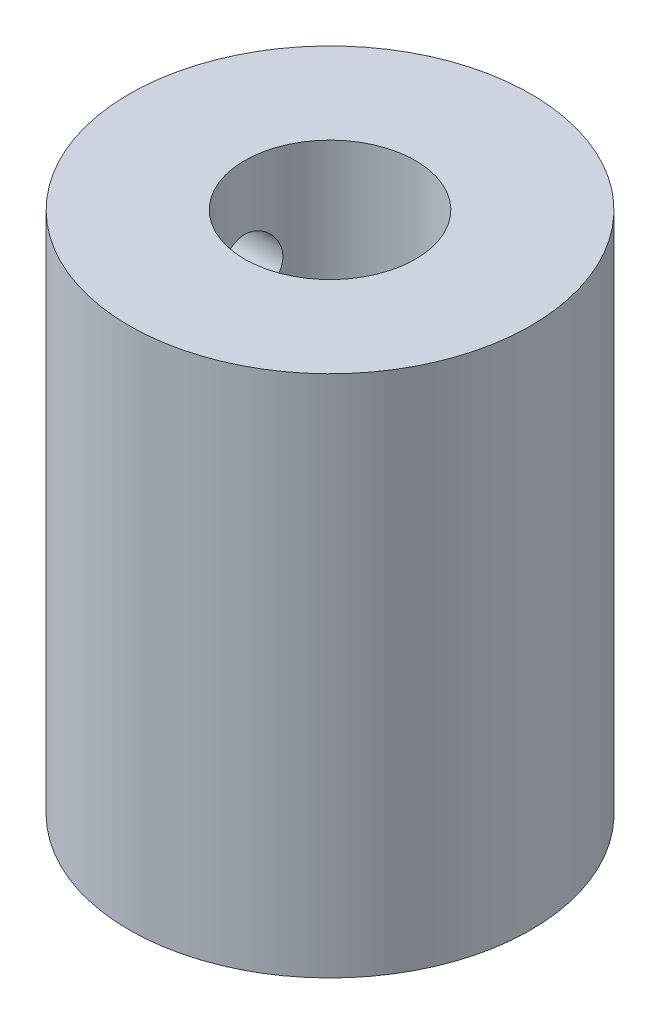
ISO-10303-21;
HEADER;
FILE_DESCRIPTION(('STEP AP214'),'2;1');
FILE_NAME('part.step','',(''),(''),'','','');
FILE_SCHEMA(('AUTOMOTIVE_DESIGN { 1 0 10303 214 1 1 1 1 }'));
ENDSEC;
DATA;
#1=APPLICATION_CONTEXT('core data for automotive mechanical design processes');
#2=APPLICATION_PROTOCOL_DEFINITION('international standard','automotive_design',2000,#1);
#3=PRODUCT_CONTEXT('',#1,'mechanical');
#4=PRODUCT('Part','Part','',(#3));
#5=PRODUCT_RELATED_PRODUCT_CATEGORY('part','',(#4));
#6=PRODUCT_DEFINITION_FORMATION('','',#4);
#7=PRODUCT_DEFINITION_CONTEXT('part definition',#1,'design');
#8=PRODUCT_DEFINITION('design','',#6,#7);
#9=PRODUCT_DEFINITION_SHAPE('','',#8);
#10=(LENGTH_UNIT() NAMED_UNIT(*) SI_UNIT(.MILLI.,.METRE.));
#11=(NAMED_UNIT(*) PLANE_ANGLE_UNIT() SI_UNIT($,.RADIAN.));
#12=(NAMED_UNIT(*) SI_UNIT($,.STERADIAN.) SOLID_ANGLE_UNIT());
#13=UNCERTAINTY_MEASURE_WITH_UNIT(LENGTH_MEASURE(1.E-05),#10,'distance_accuracy_value','');
#14=(GEOMETRIC_REPRESENTATION_CONTEXT(3) GLOBAL_UNCERTAINTY_ASSIGNED_CONTEXT((#13)) GLOBAL_UNIT_ASSIGNED_CONTEXT((#10,
#11,#12)) REPRESENTATION_CONTEXT('',''));
#15=CARTESIAN_POINT('',(0.,0.,0.));
#16=DIRECTION('',(0.,0.,1.));
#17=DIRECTION('',(1.,0.,0.));
#18=AXIS2_PLACEMENT_3D('',#15,#16,#17);
#19=CARTESIAN_POINT('',(0.,24.5,0.));
#20=DIRECTION('',(0.,1.,0.));
#21=DIRECTION('',(0.,0.,1.));
#22=AXIS2_PLACEMENT_3D('',#19,#20,#21);
#23=PLANE('',#22);
#24=CARTESIAN_POINT('',(0.,24.5,0.));
#25=DIRECTION('',(0.,1.,0.));
#26=DIRECTION('',(0.,0.,1.));
#27=AXIS2_PLACEMENT_3D('',#24,#25,#26);
#28=CIRCLE('',#27,9.4);
#29=CARTESIAN_POINT('',(0.,24.5,9.4));
#30=VERTEX_POINT('',#29);
#31=EDGE_CURVE('E10',#30,#30,#28,.T.);
#32=ORIENTED_EDGE('',*,*,#31,.T.);
#33=EDGE_LOOP('',(#32));
#34=FACE_BOUND('',#33,.T.);
#35=CARTESIAN_POINT('',(0.,24.5,0.));
#36=DIRECTION('',(0.,1.,0.));
#37=DIRECTION('',(0.,0.,1.));
#38=AXIS2_PLACEMENT_3D('',#35,#36,#37);
#39=CIRCLE('',#38,4.);
#40=CARTESIAN_POINT('',(0.,24.5,4.));
#41=VERTEX_POINT('',#40);
#42=EDGE_CURVE('E55',#41,#41,#39,.T.);
#43=ORIENTED_EDGE('',*,*,#42,.F.);
#44=EDGE_LOOP('',(#43));
#45=FACE_BOUND('',#44,.T.);
#46=ADVANCED_FACE('F36',(#34,#45),#23,.T.);
#47=CARTESIAN_POINT('',(0.,0.,0.));
#48=DIRECTION('',(0.,1.,0.));
#49=DIRECTION('',(0.,0.,1.));
#50=AXIS2_PLACEMENT_3D('',#47,#48,#49);
#51=PLANE('',#50);
#52=CARTESIAN_POINT('',(0.,0.,0.));
#53=DIRECTION('',(0.,1.,0.));
#54=DIRECTION('',(0.,0.,1.));
#55=AXIS2_PLACEMENT_3D('',#52,#53,#54);
#56=CIRCLE('',#55,9.4);
#57=CARTESIAN_POINT('',(0.,0.,9.4));
#58=VERTEX_POINT('',#57);
#59=EDGE_CURVE('E50',#58,#58,#56,.T.);
#60=ORIENTED_EDGE('',*,*,#59,.F.);
#61=EDGE_LOOP('',(#60));
#62=FACE_BOUND('',#61,.T.);
#63=CARTESIAN_POINT('',(0.,0.,0.));
#64=DIRECTION('',(0.,1.,0.));
#65=DIRECTION('',(0.,0.,1.));
#66=AXIS2_PLACEMENT_3D('',#63,#64,#65);
#67=CIRCLE('',#66,4.);
#68=CARTESIAN_POINT('',(0.,0.,4.));
#69=VERTEX_POINT('',#68);
#70=EDGE_CURVE('E58',#69,#69,#67,.T.);
#71=ORIENTED_EDGE('',*,*,#70,.T.);
#72=EDGE_LOOP('',(#71));
#73=FACE_BOUND('',#72,.T.);
#74=ADVANCED_FACE('F94',(#62,#73),#51,.F.);
#75=CARTESIAN_POINT('',(0.,24.5,0.));
#76=DIRECTION('',(0.,-1.,0.));
#77=DIRECTION('',(0.,0.,-1.));
#78=AXIS2_PLACEMENT_3D('',#75,#76,#77);
#79=CYLINDRICAL_SURFACE('',#78,9.4);
#80=CARTESIAN_POINT('',(-9.4,3.,0.));
#81=CARTESIAN_POINT('',(-9.39999860292908,3.00000339908655,-0.0836857789003803));
#82=CARTESIAN_POINT('',(-9.39887077859171,3.00702696122487,-0.167418496607772));
#83=CARTESIAN_POINT('',(-9.3944802410602,3.0349259578385,-0.332538987483233));
#84=CARTESIAN_POINT('',(-9.3912155141064,3.05581445852151,-0.413924473075796));
#85=CARTESIAN_POINT('',(-9.3829176603132,3.11079950047295,-0.571937358065425));
#86=CARTESIAN_POINT('',(-9.37788593234908,3.14488559583209,-0.648568465040697));
#87=CARTESIAN_POINT('',(-9.36660853273479,3.22527168016775,-0.795012930897301));
#88=CARTESIAN_POINT('',(-9.36036301292473,3.2715701416886,-0.864827140903446));
#89=CARTESIAN_POINT('',(-9.34728990872575,3.37550021958999,-0.996280738714871));
#90=CARTESIAN_POINT('',(-9.34045813044039,3.4332181576055,-1.05785146896413));
#91=CARTESIAN_POINT('',(-9.32701490899077,3.55816299563803,-1.17047757507708));
#92=CARTESIAN_POINT('',(-9.32040347920138,3.62539047157698,-1.22153231360512));
#93=CARTESIAN_POINT('',(-9.30810888738145,3.76791321194938,-1.31194891982853));
#94=CARTESIAN_POINT('',(-9.30243114543986,3.8432516532129,-1.35124352949974));
#95=CARTESIAN_POINT('',(-9.29270458436251,3.99956521487794,-1.41659447142563));
#96=CARTESIAN_POINT('',(-9.28865566456992,4.08053998660654,-1.44265162174584));
#97=CARTESIAN_POINT('',(-9.28268671586333,4.24510227182945,-1.48057299349724));
#98=CARTESIAN_POINT('',(-9.28074898071099,4.32866191384838,-1.49255532610323));
#99=CARTESIAN_POINT('',(-9.27916815661671,4.49662653562471,-1.5023529987421));
#100=CARTESIAN_POINT('',(-9.27952491875279,4.58103146016489,-1.50016925820927));
#101=CARTESIAN_POINT('',(-9.28247660212726,4.74745142467884,-1.48179311664287));
#102=CARTESIAN_POINT('',(-9.28505040396344,4.82948148910245,-1.46573289779084));
#103=CARTESIAN_POINT('',(-9.29211313549312,4.98966755740503,-1.42026690117827));
#104=CARTESIAN_POINT('',(-9.29660212585582,5.06782343847038,-1.39086070064291));
#105=CARTESIAN_POINT('',(-9.30701247834285,5.21844111988442,-1.31940194808493));
#106=CARTESIAN_POINT('',(-9.31294008917152,5.29087620112074,-1.27729402636579));
#107=CARTESIAN_POINT('',(-9.32555537605936,5.4277026315064,-1.18166648494931));
#108=CARTESIAN_POINT('',(-9.33224310843869,5.49209338387938,-1.12814601939762));
#109=CARTESIAN_POINT('',(-9.34571812525718,5.61176889026108,-1.01049009104128));
#110=CARTESIAN_POINT('',(-9.35250567847568,5.66694207592851,-0.94624111357437));
#111=CARTESIAN_POINT('',(-9.36534529074403,5.7657405797876,-0.809337166246673));
#112=CARTESIAN_POINT('',(-9.37139734575783,5.80936583461171,-0.736682150262153));
#113=CARTESIAN_POINT('',(-9.38209162704905,5.88383832828381,-0.584927224574365));
#114=CARTESIAN_POINT('',(-9.38673282558863,5.91467625813522,-0.505822669649441));
#115=CARTESIAN_POINT('',(-9.39407406616499,5.96259806029723,-0.343466737257515));
#116=CARTESIAN_POINT('',(-9.39677425690949,5.97968298628799,-0.260215677992101));
#117=CARTESIAN_POINT('',(-9.3999093795552,5.9994638239439,-0.0928921103699813));
#118=CARTESIAN_POINT('',(-9.40036843752436,6.00231299312803,-0.00883815585294559));
#119=CARTESIAN_POINT('',(-9.3990354729032,5.99394924295871,0.158546581234478));
#120=CARTESIAN_POINT('',(-9.39724352948276,5.98273681816502,0.241877389134836));
#121=CARTESIAN_POINT('',(-9.39162483366102,5.94669562180877,0.404981005546032));
#122=CARTESIAN_POINT('',(-9.38780934440858,5.92194219631544,0.484770884780166));
#123=CARTESIAN_POINT('',(-9.37856979195967,5.85960159951161,0.639068121481985));
#124=CARTESIAN_POINT('',(-9.3731456447838,5.82201375816952,0.713575202911422));
#125=CARTESIAN_POINT('',(-9.36123104450446,5.73471656643136,0.855861163626058));
#126=CARTESIAN_POINT('',(-9.35473225361117,5.68491083200475,0.923580196715583));
#127=CARTESIAN_POINT('',(-9.34141584789389,5.574724941677,1.04975357394106));
#128=CARTESIAN_POINT('',(-9.33459821197453,5.51434408537934,1.10820730394176));
#129=CARTESIAN_POINT('',(-9.32133515201758,5.38403677519269,1.21475432308297));
#130=CARTESIAN_POINT('',(-9.31489385732774,5.31402545535134,1.26274441475431));
#131=CARTESIAN_POINT('',(-9.30318815198079,5.16684513267429,1.34628266474539));
#132=CARTESIAN_POINT('',(-9.29792370634545,5.08967634266899,1.38183119287037));
#133=CARTESIAN_POINT('',(-9.28919827524588,4.93066855257304,1.43932041741957));
#134=CARTESIAN_POINT('',(-9.28573032022974,4.84884898829733,1.46131376569598));
#135=CARTESIAN_POINT('',(-9.2809725798083,4.68261743718157,1.49123486875253));
#136=CARTESIAN_POINT('',(-9.27968262224987,4.59820565577244,1.49916373521905));
#137=CARTESIAN_POINT('',(-9.27943392099984,4.43021544664552,1.50070178740011));
#138=CARTESIAN_POINT('',(-9.28044874617022,4.34663849973592,1.49447332796677));
#139=CARTESIAN_POINT('',(-9.28463755016577,4.18173752238263,1.46822321800111));
#140=CARTESIAN_POINT('',(-9.287811523616,4.10041348633113,1.44820160180518));
#141=CARTESIAN_POINT('',(-9.2959513032301,3.94238183457247,1.39499364428432));
#142=CARTESIAN_POINT('',(-9.30091536252848,3.86566980307003,1.36182013418357));
#143=CARTESIAN_POINT('',(-9.31207786158743,3.71887382095289,1.28326648968871));
#144=CARTESIAN_POINT('',(-9.31827635413694,3.64879015398064,1.23788583324282));
#145=CARTESIAN_POINT('',(-9.33129362625975,3.51641799859779,1.13562205521819));
#146=CARTESIAN_POINT('',(-9.33811842228315,3.45422264607109,1.07861912688003));
#147=CARTESIAN_POINT('',(-9.35157035726145,3.34022375448953,0.954981945128727));
#148=CARTESIAN_POINT('',(-9.3581974501104,3.28842262356852,0.88834546595213));
#149=CARTESIAN_POINT('',(-9.37055524925498,3.19638795348418,0.746837235944878));
#150=CARTESIAN_POINT('',(-9.37628006375307,3.15622911582005,0.671916387125346));
#151=CARTESIAN_POINT('',(-9.38613080657795,3.08912723429793,0.516333748405034));
#152=CARTESIAN_POINT('',(-9.39025835436346,3.06217079720164,0.435677871978858));
#153=CARTESIAN_POINT('',(-9.39553054266368,3.02820615337028,0.295572402618494));
#154=CARTESIAN_POINT('',(-9.39719778508943,3.01764544341047,0.236978205994379));
#155=CARTESIAN_POINT('',(-9.39943300196921,3.00354121149885,0.118930567589197));
#156=CARTESIAN_POINT('',(-9.40000099292594,2.99999758420194,0.0594771387209914));
#157=CARTESIAN_POINT('',(-9.4,3.,0.));
#158=B_SPLINE_CURVE_WITH_KNOTS('',3,(#80,#81,#82,#83,#84,#85,#86,#87,#88,#89,#90,#91,#92,#93,
#94,#95,#96,#97,#98,#99,#100,#101,#102,#103,#104,#105,#106,#107,#108,#109,#110,#111,#112,#113,
#114,#115,#116,#117,#118,#119,#120,#121,#122,#123,#124,#125,#126,#127,#128,#129,#130,#131,#132,
#133,#134,#135,#136,#137,#138,#139,#140,#141,#142,#143,#144,#145,#146,#147,#148,#149,#150,#151,
#152,#153,#154,#155,#156,#157),.UNSPECIFIED.,.T.,.F.,(4,2,2,2,2,2,2,2,2,2,2,2,2,2,2,2,2,2,2,2,2,
2,2,2,2,2,2,2,2,2,2,2,2,2,2,2,2,2,4),(0.,0.250839961665604,0.50191664917309,0.752795014147739,
1.00364201550154,1.25646311863702,1.50929953982558,1.76355549094707,2.0177957273208,
2.26988686702206,2.52196164517307,2.77166139768042,3.02136906074377,3.27218138553335,
3.52301230604393,3.77668826525693,4.0303656164498,4.2842273184147,4.53806956902889,
4.78917305817339,5.04026771601461,5.28997921531406,5.53970375300837,5.79146550750159,
6.04324394263323,6.29740324834593,6.5515549989451,6.80471323165459,7.05785145331003,
7.30810137611369,7.55835067595277,7.80835642652347,8.05837287056011,8.3111102507431,
8.56390611770033,8.81828983379431,9.07241495181823,9.2506945517148,9.42897147513942),.UNSPECIFIED.);
#159=CARTESIAN_POINT('',(-9.4,3.,0.));
#160=VERTEX_POINT('',#159);
#161=EDGE_CURVE('E83',#160,#160,#158,.T.);
#162=ORIENTED_EDGE('',*,*,#161,.T.);
#163=EDGE_LOOP('',(#162));
#164=FACE_BOUND('',#163,.T.);
#165=CARTESIAN_POINT('',(-9.4,18.5,0.));
#166=CARTESIAN_POINT('',(-9.39999860292908,18.5000033990866,-0.0836857789003804));
#167=CARTESIAN_POINT('',(-9.39887077859171,18.5070269612249,-0.167418496607772));
#168=CARTESIAN_POINT('',(-9.3944802410602,18.5349259578385,-0.332538987483233));
#169=CARTESIAN_POINT('',(-9.3912155141064,18.5558144585215,-0.413924473075796));
#170=CARTESIAN_POINT('',(-9.3829176603132,18.610799500473,-0.571937358065426));
#171=CARTESIAN_POINT('',(-9.37788593234908,18.6448855958321,-0.648568465040698));
#172=CARTESIAN_POINT('',(-9.36660853273479,18.7252716801677,-0.795012930897303));
#173=CARTESIAN_POINT('',(-9.36036301292473,18.7715701416886,-0.864827140903447));
#174=CARTESIAN_POINT('',(-9.34728990872575,18.87550021959,-0.996280738714872));
#175=CARTESIAN_POINT('',(-9.34045813044039,18.9332181576055,-1.05785146896413));
#176=CARTESIAN_POINT('',(-9.32701490899077,19.058162995638,-1.17047757507708));
#177=CARTESIAN_POINT('',(-9.32040347920138,19.125390471577,-1.22153231360512));
#178=CARTESIAN_POINT('',(-9.30810888738145,19.2679132119494,-1.31194891982853));
#179=CARTESIAN_POINT('',(-9.30243114543986,19.3432516532129,-1.35124352949974));
#180=CARTESIAN_POINT('',(-9.29270458436251,19.4995652148779,-1.41659447142564));
#181=CARTESIAN_POINT('',(-9.28865566456992,19.5805399866065,-1.44265162174584));
#182=CARTESIAN_POINT('',(-9.28268671586333,19.7451022718294,-1.48057299349724));
#183=CARTESIAN_POINT('',(-9.28074898071099,19.8286619138484,-1.49255532610323));
#184=CARTESIAN_POINT('',(-9.27916815661671,19.9966265356247,-1.5023529987421));
#185=CARTESIAN_POINT('',(-9.27952491875279,20.0810314601649,-1.50016925820927));
#186=CARTESIAN_POINT('',(-9.28247660212726,20.2474514246788,-1.48179311664287));
#187=CARTESIAN_POINT('',(-9.28505040396344,20.3294814891024,-1.46573289779084));
#188=CARTESIAN_POINT('',(-9.29211313549312,20.489667557405,-1.42026690117827));
#189=CARTESIAN_POINT('',(-9.29660212585582,20.5678234384704,-1.39086070064291));
#190=CARTESIAN_POINT('',(-9.30701247834285,20.7184411198844,-1.31940194808493));
#191=CARTESIAN_POINT('',(-9.31294008917152,20.7908762011207,-1.27729402636579));
#192=CARTESIAN_POINT('',(-9.32555537605936,20.9277026315064,-1.18166648494931));
#193=CARTESIAN_POINT('',(-9.33224310843869,20.9920933838794,-1.12814601939762));
#194=CARTESIAN_POINT('',(-9.34571812525718,21.1117688902611,-1.01049009104127));
#195=CARTESIAN_POINT('',(-9.35250567847568,21.1669420759285,-0.946241113574369));
#196=CARTESIAN_POINT('',(-9.36534529074403,21.2657405797876,-0.809337166246673));
#197=CARTESIAN_POINT('',(-9.37139734575783,21.3093658346117,-0.736682150262153));
#198=CARTESIAN_POINT('',(-9.38209162704905,21.3838383282838,-0.584927224574364));
#199=CARTESIAN_POINT('',(-9.38673282558863,21.4146762581352,-0.50582266964944));
#200=CARTESIAN_POINT('',(-9.39407406616499,21.4625980602972,-0.343466737257514));
#201=CARTESIAN_POINT('',(-9.39677425690949,21.479682986288,-0.2602156779921));
#202=CARTESIAN_POINT('',(-9.3999093795552,21.4994638239439,-0.0928921103699806));
#203=CARTESIAN_POINT('',(-9.40036843752436,21.502312993128,-0.00883815585294493));
#204=CARTESIAN_POINT('',(-9.3990354729032,21.4939492429587,0.158546581234479));
#205=CARTESIAN_POINT('',(-9.39724352948276,21.482736818165,0.241877389134837));
#206=CARTESIAN_POINT('',(-9.39162483366102,21.4466956218088,0.404981005546033));
#207=CARTESIAN_POINT('',(-9.38780934440858,21.4219421963154,0.484770884780167));
#208=CARTESIAN_POINT('',(-9.37856979195967,21.3596015995116,0.639068121481986));
#209=CARTESIAN_POINT('',(-9.3731456447838,21.3220137581695,0.713575202911423));
#210=CARTESIAN_POINT('',(-9.36123104450446,21.2347165664314,0.855861163626059));
#211=CARTESIAN_POINT('',(-9.35473225361117,21.1849108320047,0.923580196715583));
#212=CARTESIAN_POINT('',(-9.34141584789389,21.074724941677,1.04975357394106));
#213=CARTESIAN_POINT('',(-9.33459821197453,21.0143440853793,1.10820730394176));
#214=CARTESIAN_POINT('',(-9.32133515201758,20.8840367751927,1.21475432308297));
#215=CARTESIAN_POINT('',(-9.31489385732774,20.8140254553513,1.26274441475431));
#216=CARTESIAN_POINT('',(-9.30318815198079,20.6668451326743,1.34628266474539));
#217=CARTESIAN_POINT('',(-9.29792370634545,20.589676342669,1.38183119287038));
#218=CARTESIAN_POINT('',(-9.28919827524588,20.430668552573,1.43932041741957));
#219=CARTESIAN_POINT('',(-9.28573032022974,20.3488489882973,1.46131376569598));
#220=CARTESIAN_POINT('',(-9.2809725798083,20.1826174371816,1.49123486875253));
#221=CARTESIAN_POINT('',(-9.27968262224987,20.0982056557724,1.49916373521905));
#222=CARTESIAN_POINT('',(-9.27943392099984,19.9302154466455,1.50070178740011));
#223=CARTESIAN_POINT('',(-9.28044874617022,19.8466384997359,1.49447332796677));
#224=CARTESIAN_POINT('',(-9.28463755016577,19.6817375223826,1.46822321800111));
#225=CARTESIAN_POINT('',(-9.287811523616,19.6004134863311,1.44820160180518));
#226=CARTESIAN_POINT('',(-9.2959513032301,19.4423818345725,1.39499364428432));
#227=CARTESIAN_POINT('',(-9.30091536252848,19.36566980307,1.36182013418357));
#228=CARTESIAN_POINT('',(-9.31207786158743,19.2188738209529,1.28326648968871));
#229=CARTESIAN_POINT('',(-9.31827635413694,19.1487901539806,1.23788583324282));
#230=CARTESIAN_POINT('',(-9.33129362625975,19.0164179985978,1.13562205521819));
#231=CARTESIAN_POINT('',(-9.33811842228315,18.9542226460711,1.07861912688003));
#232=CARTESIAN_POINT('',(-9.35157035726145,18.8402237544895,0.954981945128728));
#233=CARTESIAN_POINT('',(-9.3581974501104,18.7884226235685,0.88834546595213));
#234=CARTESIAN_POINT('',(-9.37055524925498,18.6963879534842,0.746837235944877));
#235=CARTESIAN_POINT('',(-9.37628006375307,18.6562291158201,0.671916387125345));
#236=CARTESIAN_POINT('',(-9.38613080657795,18.5891272342979,0.516333748405034));
#237=CARTESIAN_POINT('',(-9.39025835436346,18.5621707972016,0.435677871978858));
#238=CARTESIAN_POINT('',(-9.39553054266368,18.5282061533703,0.295572402618495));
#239=CARTESIAN_POINT('',(-9.39719778508943,18.5176454434105,0.23697820599438));
#240=CARTESIAN_POINT('',(-9.39943300196921,18.5035412114988,0.118930567589197));
#241=CARTESIAN_POINT('',(-9.40000099292594,18.4999975842019,0.0594771387209916));
#242=CARTESIAN_POINT('',(-9.4,18.5,0.));
#243=B_SPLINE_CURVE_WITH_KNOTS('',3,(#165,#166,#167,#168,#169,#170,#171,#172,#173,#174,#175,
#176,#177,#178,#179,#180,#181,#182,#183,#184,#185,#186,#187,#188,#189,#190,#191,#192,#193,#194,
#195,#196,#197,#198,#199,#200,#201,#202,#203,#204,#205,#206,#207,#208,#209,#210,#211,#212,#213,
#214,#215,#216,#217,#218,#219,#220,#221,#222,#223,#224,#225,#226,#227,#228,#229,#230,#231,#232,
#233,#234,#235,#236,#237,#238,#239,#240,#241,#242),.UNSPECIFIED.,.T.,.F.,(4,2,2,2,2,2,2,2,2,2,2,
2,2,2,2,2,2,2,2,2,2,2,2,2,2,2,2,2,2,2,2,2,2,2,2,2,2,2,4),(0.,0.250839961665604,
0.501916649173092,0.75279501414774,1.00364201550154,1.25646311863703,1.50929953982558,
1.76355549094707,2.0177957273208,2.26988686702206,2.52196164517307,2.77166139768042,
3.02136906074377,3.27218138553335,3.52301230604394,3.77668826525693,4.0303656164498,
4.2842273184147,4.53806956902889,4.7891730581734,5.04026771601461,5.28997921531406,
5.53970375300837,5.79146550750159,6.04324394263324,6.29740324834594,6.55155499894511,
6.8047132316546,7.05785145331004,7.30810137611369,7.55835067595278,7.80835642652348,
8.05837287056012,8.31111025074311,8.56390611770034,8.81828983379431,9.07241495181824,
9.2506945517148,9.42897147513943),.UNSPECIFIED.);
#244=CARTESIAN_POINT('',(-9.4,18.5,0.));
#245=VERTEX_POINT('',#244);
#246=EDGE_CURVE('E66',#245,#245,#243,.T.);
#247=ORIENTED_EDGE('',*,*,#246,.T.);
#248=EDGE_LOOP('',(#247));
#249=FACE_BOUND('',#248,.T.);
#250=ORIENTED_EDGE('',*,*,#31,.F.);
#251=EDGE_LOOP('',(#250));
#252=FACE_BOUND('',#251,.T.);
#253=ORIENTED_EDGE('',*,*,#59,.T.);
#254=EDGE_LOOP('',(#253));
#255=FACE_BOUND('',#254,.T.);
#256=ADVANCED_FACE('F38',(#164,#249,#252,#255),#79,.T.);
#257=CARTESIAN_POINT('',(0.,24.5,0.));
#258=DIRECTION('',(0.,-1.,0.));
#259=DIRECTION('',(0.,0.,-1.));
#260=AXIS2_PLACEMENT_3D('',#257,#258,#259);
#261=CYLINDRICAL_SURFACE('',#260,4.);
#262=CARTESIAN_POINT('',(-3.70809924354783,4.5,-1.5));
#263=CARTESIAN_POINT('',(-3.70809640633806,4.58100748372079,-1.50000304106109));
#264=CARTESIAN_POINT('',(-3.71078260240986,4.66199492250364,-1.49341597549487));
#265=CARTESIAN_POINT('',(-3.72116159304967,4.8215280829132,-1.46736187895468));
#266=CARTESIAN_POINT('',(-3.72885423767112,4.90007387759501,-1.44789523373263));
#267=CARTESIAN_POINT('',(-3.748254802809,5.05237537161353,-1.39689657610574));
#268=CARTESIAN_POINT('',(-3.7599530956926,5.12614205665108,-1.36539347266348));
#269=CARTESIAN_POINT('',(-3.78603134206598,5.26737189681884,-1.29131856742698));
#270=CARTESIAN_POINT('',(-3.80041210067323,5.33483315028252,-1.24874344095039));
#271=CARTESIAN_POINT('',(-3.83103574665713,5.46489031162282,-1.15146661374162));
#272=CARTESIAN_POINT('',(-3.84733341923603,5.52712852962939,-1.09630381213306));
#273=CARTESIAN_POINT('',(-3.87949750628547,5.64172281467149,-0.976395839778925));
#274=CARTESIAN_POINT('',(-3.89536382814785,5.69407677374185,-0.911648630256679));
#275=CARTESIAN_POINT('',(-3.92552873936553,5.78913951229561,-0.7716946551776));
#276=CARTESIAN_POINT('',(-3.93975561223505,5.83145947471586,-0.696206947538027));
#277=CARTESIAN_POINT('',(-3.96438007973848,5.90265117252491,-0.538555771965246));
#278=CARTESIAN_POINT('',(-3.97477900217006,5.93152757199197,-0.456394630933535));
#279=CARTESIAN_POINT('',(-3.9901869710344,5.97375789577462,-0.291489341676831));
#280=CARTESIAN_POINT('',(-3.99540915214774,5.98772762744046,-0.208923197281595));
#281=CARTESIAN_POINT('',(-4.0006401410794,6.00172120094499,-0.042464363794785));
#282=CARTESIAN_POINT('',(-4.00065064414902,6.00174957761871,0.0414278850628339));
#283=CARTESIAN_POINT('',(-3.99559265903894,5.98821823853483,0.203743543064477));
#284=CARTESIAN_POINT('',(-3.99077541996683,5.97533070205119,0.282232178266901));
#285=CARTESIAN_POINT('',(-3.97693274932263,5.93746408477445,0.435839217984392));
#286=CARTESIAN_POINT('',(-3.96790701975577,5.91248414773796,0.510957383430299));
#287=CARTESIAN_POINT('',(-3.9463776916753,5.85082954832415,0.656989017303105));
#288=CARTESIAN_POINT('',(-3.93382539470077,5.81398999473159,0.72782539228731));
#289=CARTESIAN_POINT('',(-3.90651310225279,5.72980790307061,0.86248660795756));
#290=CARTESIAN_POINT('',(-3.8917523951284,5.6824619769824,0.926309176932323));
#291=CARTESIAN_POINT('',(-3.86052529655816,5.57537271371681,1.04909048680094));
#292=CARTESIAN_POINT('',(-3.84400963763883,5.51506608434957,1.10754614526348));
#293=CARTESIAN_POINT('',(-3.81182460645722,5.38540700667844,1.21370395569342));
#294=CARTESIAN_POINT('',(-3.79615544748847,5.31605229341336,1.261403406929));
#295=CARTESIAN_POINT('',(-3.76712703500335,5.16828053253718,1.34565611808152));
#296=CARTESIAN_POINT('',(-3.75382677150277,5.08969650631393,1.38193847851831));
#297=CARTESIAN_POINT('',(-3.73172438629002,4.92690377483243,1.44056464441501));
#298=CARTESIAN_POINT('',(-3.72291976205783,4.84269822840631,1.46291620605595));
#299=CARTESIAN_POINT('',(-3.71139597222848,4.67602403768405,1.49190191709668));
#300=CARTESIAN_POINT('',(-3.70836785241537,4.59371589446386,1.49933521158966));
#301=CARTESIAN_POINT('',(-3.70786539525016,4.42899064325826,1.50057885636272));
#302=CARTESIAN_POINT('',(-3.71038967003987,4.34657356764753,1.49439261093762));
#303=CARTESIAN_POINT('',(-3.72039381629735,4.18807007771232,1.46929733520157));
#304=CARTESIAN_POINT('',(-3.72763276216449,4.11186886423534,1.45100618334224));
#305=CARTESIAN_POINT('',(-3.74596487046362,3.9636520552798,1.40299774640637));
#306=CARTESIAN_POINT('',(-3.75705882250173,3.89163732083186,1.37327812034623));
#307=CARTESIAN_POINT('',(-3.7823624311608,3.75083556192379,1.30200292275278));
#308=CARTESIAN_POINT('',(-3.79667328892065,3.68227070786266,1.26004545177047));
#309=CARTESIAN_POINT('',(-3.82662814294291,3.55287101827396,1.16591317862479));
#310=CARTESIAN_POINT('',(-3.84227262594077,3.49203902537537,1.11373463696435));
#311=CARTESIAN_POINT('',(-3.87433046553184,3.3758316268049,0.996727340900938));
#312=CARTESIAN_POINT('',(-3.89072969357028,3.32104659123125,0.931306341491061));
#313=CARTESIAN_POINT('',(-3.92149874963302,3.22316163241056,0.79179747175315));
#314=CARTESIAN_POINT('',(-3.93586857107664,3.18006174705416,0.717709573322673));
#315=CARTESIAN_POINT('',(-3.96094985704552,3.10705394380039,0.563016329468476));
#316=CARTESIAN_POINT('',(-3.9716738133801,3.0771008762074,0.482434433064626));
#317=CARTESIAN_POINT('',(-3.98829436712571,3.03134358615008,0.316881887523254));
#318=CARTESIAN_POINT('',(-3.99419323299412,3.0155327145776,0.231913320723592));
#319=CARTESIAN_POINT('',(-4.00028407317073,2.99922559724517,0.0653355852738143));
#320=CARTESIAN_POINT('',(-4.00078860953764,2.99789051694101,-0.0161807680608464));
#321=CARTESIAN_POINT('',(-3.99684889809223,3.00841515944539,-0.178226786412425));
#322=CARTESIAN_POINT('',(-3.9924052471313,3.02027329088586,-0.258756569245258));
#323=CARTESIAN_POINT('',(-3.97921089603771,3.05625885149362,-0.414548248377127));
#324=CARTESIAN_POINT('',(-3.97056791378017,3.08007990587836,-0.489890731068835));
#325=CARTESIAN_POINT('',(-3.9498778362099,3.13901001338436,-0.63551547300639));
#326=CARTESIAN_POINT('',(-3.93783009655664,3.17412120330475,-0.705796771275543));
#327=CARTESIAN_POINT('',(-3.91090618300074,3.25631394350481,-0.842540176994414));
#328=CARTESIAN_POINT('',(-3.89593240108828,3.30383664051415,-0.908717548846851));
#329=CARTESIAN_POINT('',(-3.86499507694844,3.40880783018761,-1.03241734752336));
#330=CARTESIAN_POINT('',(-3.84903118274027,3.46625986580788,-1.0899366712559));
#331=CARTESIAN_POINT('',(-3.81688129739175,3.59306413164506,-1.19781214236196));
#332=CARTESIAN_POINT('',(-3.8007280534916,3.66288440215431,-1.24762999816025));
#333=CARTESIAN_POINT('',(-3.77098325003638,3.81041586957333,-1.33484709556843));
#334=CARTESIAN_POINT('',(-3.75739195631216,3.88812788405348,-1.37224504878157));
#335=CARTESIAN_POINT('',(-3.73402269853266,4.05295568097541,-1.4346588697426));
#336=CARTESIAN_POINT('',(-3.7244380329086,4.14033436651178,-1.45906002899523));
#337=CARTESIAN_POINT('',(-3.71147994336315,4.31848527195579,-1.49172356722079));
#338=CARTESIAN_POINT('',(-3.70810242179736,4.40925521270999,-1.49999659339571));
#339=CARTESIAN_POINT('',(-3.70809924354783,4.5,-1.5));
#340=B_SPLINE_CURVE_WITH_KNOTS('',3,(#262,#263,#264,#265,#266,#267,#268,#269,#270,#271,#272,
#273,#274,#275,#276,#277,#278,#279,#280,#281,#282,#283,#284,#285,#286,#287,#288,#289,#290,#291,
#292,#293,#294,#295,#296,#297,#298,#299,#300,#301,#302,#303,#304,#305,#306,#307,#308,#309,#310,
#311,#312,#313,#314,#315,#316,#317,#318,#319,#320,#321,#322,#323,#324,#325,#326,#327,#328,#329,
#330,#331,#332,#333,#334,#335,#336,#337,#338,#339),.UNSPECIFIED.,.T.,.F.,(4,2,2,2,2,2,2,2,2,2,2,
2,2,2,2,2,2,2,2,2,2,2,2,2,2,2,2,2,2,2,2,2,2,2,2,2,2,2,4),(0.,0.24268454141617,0.485361814598855,
0.72745985675703,0.969630679682933,1.22274652401128,1.47591628822983,1.73770072136421,
1.9993942638133,2.24980018489679,2.50012465404857,2.73806472803194,2.97602165263335,
3.21744131210668,3.45893893628976,3.71456675065875,3.97025867827335,4.23162592252967,
4.49284751635474,4.73965657740485,4.98640395388885,5.22143845928199,5.45652113429526,
5.70041561005822,5.94439948466355,6.20385016993624,6.46330169650178,6.72185508890168,
6.98028685560127,7.22365720549936,7.4669982031948,7.7044027400389,7.94185223512831,
8.18928323676987,8.43680270894965,8.69738599542079,8.95799630544242,9.23003178870926,
9.50188762323053),.UNSPECIFIED.);
#341=CARTESIAN_POINT('',(-3.70809924354783,4.5,-1.5));
#342=VERTEX_POINT('',#341);
#343=EDGE_CURVE('E41',#342,#342,#340,.T.);
#344=ORIENTED_EDGE('',*,*,#343,.F.);
#345=EDGE_LOOP('',(#344));
#346=FACE_BOUND('',#345,.T.);
#347=CARTESIAN_POINT('',(-3.70809924354783,20.,-1.5));
#348=CARTESIAN_POINT('',(-3.70809640633806,20.0810074837208,-1.50000304106109));
#349=CARTESIAN_POINT('',(-3.71078260240986,20.1619949225036,-1.49341597549487));
#350=CARTESIAN_POINT('',(-3.72116159304967,20.3215280829132,-1.46736187895468));
#351=CARTESIAN_POINT('',(-3.72885423767112,20.400073877595,-1.44789523373263));
#352=CARTESIAN_POINT('',(-3.748254802809,20.5523753716135,-1.39689657610574));
#353=CARTESIAN_POINT('',(-3.7599530956926,20.6261420566511,-1.36539347266348));
#354=CARTESIAN_POINT('',(-3.78603134206598,20.7673718968188,-1.29131856742698));
#355=CARTESIAN_POINT('',(-3.80041210067323,20.8348331502825,-1.24874344095039));
#356=CARTESIAN_POINT('',(-3.83103574665713,20.9648903116228,-1.15146661374162));
#357=CARTESIAN_POINT('',(-3.84733341923603,21.0271285296294,-1.09630381213306));
#358=CARTESIAN_POINT('',(-3.87949750628547,21.1417228146715,-0.976395839778928));
#359=CARTESIAN_POINT('',(-3.89536382814785,21.1940767737419,-0.911648630256682));
#360=CARTESIAN_POINT('',(-3.92552873936553,21.2891395122956,-0.771694655177603));
#361=CARTESIAN_POINT('',(-3.93975561223505,21.3314594747159,-0.69620694753803));
#362=CARTESIAN_POINT('',(-3.96438007973847,21.4026511725249,-0.53855577196525));
#363=CARTESIAN_POINT('',(-3.97477900217006,21.431527571992,-0.456394630933538));
#364=CARTESIAN_POINT('',(-3.9901869710344,21.4737578957746,-0.291489341676833));
#365=CARTESIAN_POINT('',(-3.99540915214774,21.4877276274405,-0.208923197281597));
#366=CARTESIAN_POINT('',(-4.0006401410794,21.501721200945,-0.0424643637947866));
#367=CARTESIAN_POINT('',(-4.00065064414902,21.5017495776187,0.0414278850628326));
#368=CARTESIAN_POINT('',(-3.99559265903894,21.4882182385348,0.203743543064476));
#369=CARTESIAN_POINT('',(-3.99077541996683,21.4753307020512,0.2822321782669));
#370=CARTESIAN_POINT('',(-3.97693274932263,21.4374640847744,0.435839217984391));
#371=CARTESIAN_POINT('',(-3.96790701975577,21.412484147738,0.510957383430298));
#372=CARTESIAN_POINT('',(-3.94637769167531,21.3508295483242,0.656989017303104));
#373=CARTESIAN_POINT('',(-3.93382539470077,21.3139899947316,0.72782539228731));
#374=CARTESIAN_POINT('',(-3.90651310225279,21.2298079030706,0.862486607957561));
#375=CARTESIAN_POINT('',(-3.8917523951284,21.1824619769824,0.926309176932324));
#376=CARTESIAN_POINT('',(-3.86052529655816,21.0753727137168,1.04909048680094));
#377=CARTESIAN_POINT('',(-3.84400963763883,21.0150660843496,1.10754614526348));
#378=CARTESIAN_POINT('',(-3.81182460645722,20.8854070066784,1.21370395569343));
#379=CARTESIAN_POINT('',(-3.79615544748847,20.8160522934134,1.261403406929));
#380=CARTESIAN_POINT('',(-3.76712703500335,20.6682805325372,1.34565611808152));
#381=CARTESIAN_POINT('',(-3.75382677150277,20.5896965063139,1.38193847851831));
#382=CARTESIAN_POINT('',(-3.73172438629002,20.4269037748324,1.44056464441501));
#383=CARTESIAN_POINT('',(-3.72291976205783,20.3426982284063,1.46291620605595));
#384=CARTESIAN_POINT('',(-3.71139597222848,20.176024037684,1.49190191709668));
#385=CARTESIAN_POINT('',(-3.70836785241537,20.0937158944639,1.49933521158966));
#386=CARTESIAN_POINT('',(-3.70786539525016,19.9289906432583,1.50057885636272));
#387=CARTESIAN_POINT('',(-3.71038967003987,19.8465735676475,1.49439261093762));
#388=CARTESIAN_POINT('',(-3.72039381629735,19.6880700777123,1.46929733520157));
#389=CARTESIAN_POINT('',(-3.72763276216449,19.6118688642353,1.45100618334225));
#390=CARTESIAN_POINT('',(-3.74596487046361,19.4636520552798,1.40299774640638));
#391=CARTESIAN_POINT('',(-3.75705882250172,19.3916373208319,1.37327812034623));
#392=CARTESIAN_POINT('',(-3.7823624311608,19.2508355619238,1.30200292275278));
#393=CARTESIAN_POINT('',(-3.79667328892065,19.1822707078627,1.26004545177047));
#394=CARTESIAN_POINT('',(-3.82662814294291,19.052871018274,1.16591317862479));
#395=CARTESIAN_POINT('',(-3.84227262594077,18.9920390253754,1.11373463696435));
#396=CARTESIAN_POINT('',(-3.87433046553184,18.8758316268049,0.996727340900939));
#397=CARTESIAN_POINT('',(-3.89072969357027,18.8210465912312,0.931306341491063));
#398=CARTESIAN_POINT('',(-3.92149874963302,18.7231616324106,0.791797471753153));
#399=CARTESIAN_POINT('',(-3.93586857107664,18.6800617470542,0.717709573322676));
#400=CARTESIAN_POINT('',(-3.96094985704552,18.6070539438004,0.56301632946848));
#401=CARTESIAN_POINT('',(-3.9716738133801,18.5771008762074,0.48243443306463));
#402=CARTESIAN_POINT('',(-3.98829436712571,18.5313435861501,0.316881887523257));
#403=CARTESIAN_POINT('',(-3.99419323299412,18.5155327145776,0.231913320723595));
#404=CARTESIAN_POINT('',(-4.00028407317073,18.4992255972452,0.0653355852738176));
#405=CARTESIAN_POINT('',(-4.00078860953764,18.497890516941,-0.0161807680608432));
#406=CARTESIAN_POINT('',(-3.99684889809224,18.5084151594454,-0.178226786412422));
#407=CARTESIAN_POINT('',(-3.9924052471313,18.5202732908859,-0.258756569245256));
#408=CARTESIAN_POINT('',(-3.97921089603771,18.5562588514936,-0.414548248377125));
#409=CARTESIAN_POINT('',(-3.97056791378017,18.5800799058784,-0.489890731068833));
#410=CARTESIAN_POINT('',(-3.9498778362099,18.6390100133844,-0.635515473006389));
#411=CARTESIAN_POINT('',(-3.93783009655664,18.6741212033048,-0.705796771275541));
#412=CARTESIAN_POINT('',(-3.91090618300074,18.7563139435048,-0.842540176994412));
#413=CARTESIAN_POINT('',(-3.89593240108828,18.8038366405141,-0.908717548846849));
#414=CARTESIAN_POINT('',(-3.86499507694844,18.9088078301876,-1.03241734752336));
#415=CARTESIAN_POINT('',(-3.84903118274027,18.9662598658079,-1.0899366712559));
#416=CARTESIAN_POINT('',(-3.81688129739175,19.0930641316451,-1.19781214236196));
#417=CARTESIAN_POINT('',(-3.8007280534916,19.1628844021543,-1.24762999816025));
#418=CARTESIAN_POINT('',(-3.77098325003638,19.3104158695733,-1.33484709556843));
#419=CARTESIAN_POINT('',(-3.75739195631216,19.3881278840535,-1.37224504878157));
#420=CARTESIAN_POINT('',(-3.73402269853266,19.5529556809754,-1.4346588697426));
#421=CARTESIAN_POINT('',(-3.7244380329086,19.6403343665118,-1.45906002899523));
#422=CARTESIAN_POINT('',(-3.71147994336315,19.8184852719558,-1.49172356722079));
#423=CARTESIAN_POINT('',(-3.70810242179736,19.90925521271,-1.49999659339571));
#424=CARTESIAN_POINT('',(-3.70809924354783,20.,-1.5));
#425=B_SPLINE_CURVE_WITH_KNOTS('',3,(#347,#348,#349,#350,#351,#352,#353,#354,#355,#356,#357,
#358,#359,#360,#361,#362,#363,#364,#365,#366,#367,#368,#369,#370,#371,#372,#373,#374,#375,#376,
#377,#378,#379,#380,#381,#382,#383,#384,#385,#386,#387,#388,#389,#390,#391,#392,#393,#394,#395,
#396,#397,#398,#399,#400,#401,#402,#403,#404,#405,#406,#407,#408,#409,#410,#411,#412,#413,#414,
#415,#416,#417,#418,#419,#420,#421,#422,#423,#424),.UNSPECIFIED.,.T.,.F.,(4,2,2,2,2,2,2,2,2,2,2,
2,2,2,2,2,2,2,2,2,2,2,2,2,2,2,2,2,2,2,2,2,2,2,2,2,2,2,4),(0.,0.242684541416171,
0.485361814598854,0.727459856757032,0.969630679682935,1.22274652401128,1.47591628822983,
1.73770072136421,1.9993942638133,2.24980018489679,2.50012465404857,2.73806472803194,
2.97602165263335,3.21744131210668,3.45893893628976,3.71456675065875,3.97025867827335,
4.23162592252966,4.49284751635474,4.73965657740485,4.98640395388884,5.22143845928199,
5.45652113429527,5.70041561005822,5.94439948466356,6.20385016993624,6.46330169650178,
6.72185508890169,6.98028685560127,7.22365720549936,7.4669982031948,7.70440274003891,
7.94185223512831,8.18928323676987,8.43680270894965,8.6973859954208,8.95799630544243,
9.23003178870927,9.50188762323054),.UNSPECIFIED.);
#426=CARTESIAN_POINT('',(-3.70809924354783,20.,-1.5));
#427=VERTEX_POINT('',#426);
#428=EDGE_CURVE('E60',#427,#427,#425,.T.);
#429=ORIENTED_EDGE('',*,*,#428,.F.);
#430=EDGE_LOOP('',(#429));
#431=FACE_BOUND('',#430,.T.);
#432=ORIENTED_EDGE('',*,*,#42,.T.);
#433=EDGE_LOOP('',(#432));
#434=FACE_BOUND('',#433,.T.);
#435=ORIENTED_EDGE('',*,*,#70,.F.);
#436=EDGE_LOOP('',(#435));
#437=FACE_BOUND('',#436,.T.);
#438=ADVANCED_FACE('F67',(#346,#431,#434,#437),#261,.F.);
#439=CARTESIAN_POINT('',(-9.4,20.,0.));
#440=DIRECTION('',(1.,0.,0.));
#441=DIRECTION('',(0.,0.,-1.));
#442=AXIS2_PLACEMENT_3D('',#439,#440,#441);
#443=CYLINDRICAL_SURFACE('',#442,1.5);
#444=ORIENTED_EDGE('',*,*,#428,.T.);
#445=EDGE_LOOP('',(#444));
#446=FACE_BOUND('',#445,.T.);
#447=ORIENTED_EDGE('',*,*,#246,.F.);
#448=EDGE_LOOP('',(#447));
#449=FACE_BOUND('',#448,.T.);
#450=ADVANCED_FACE('F70',(#446,#449),#443,.F.);
#451=CARTESIAN_POINT('',(-9.4,4.5,0.));
#452=DIRECTION('',(1.,0.,0.));
#453=DIRECTION('',(0.,0.,-1.));
#454=AXIS2_PLACEMENT_3D('',#451,#452,#453);
#455=CYLINDRICAL_SURFACE('',#454,1.5);
#456=ORIENTED_EDGE('',*,*,#343,.T.);
#457=EDGE_LOOP('',(#456));
#458=FACE_BOUND('',#457,.T.);
#459=ORIENTED_EDGE('',*,*,#161,.F.);
#460=EDGE_LOOP('',(#459));
#461=FACE_BOUND('',#460,.T.);
#462=ADVANCED_FACE('F73',(#458,#461),#455,.F.);
#463=CLOSED_SHELL('',(#46,#74,#256,#438,#450,#462));
#464=MANIFOLD_SOLID_BREP('B2',#463);
#465=ADVANCED_BREP_SHAPE_REPRESENTATION('',(#18,#464),#14);
#466=SHAPE_DEFINITION_REPRESENTATION(#9,#465);
ENDSEC;
END-ISO-10303-21;
